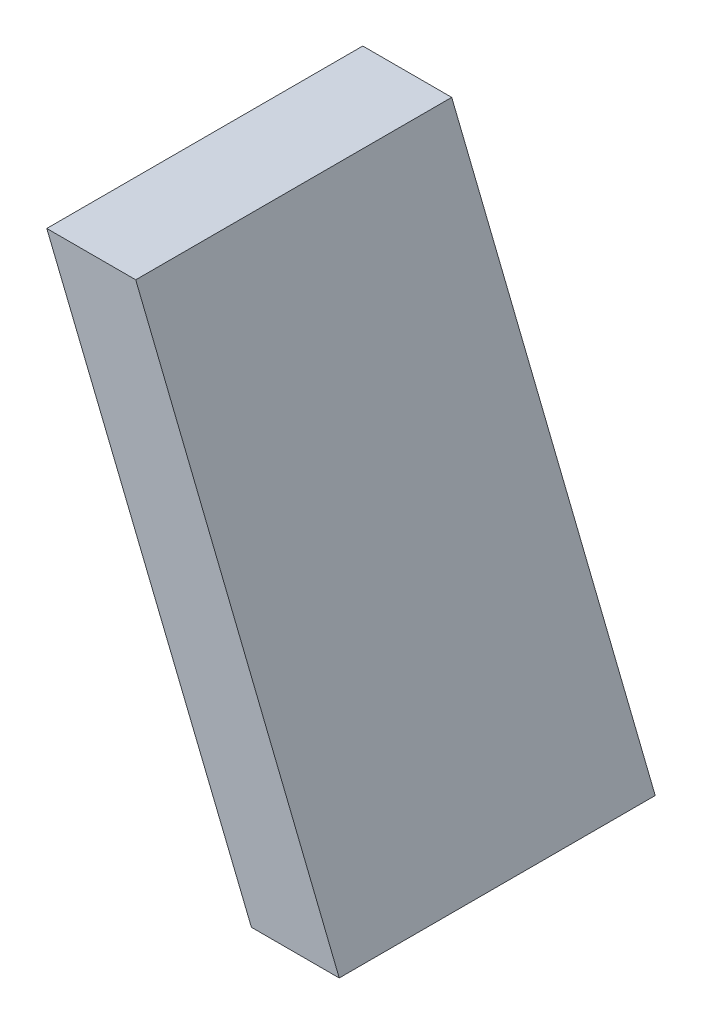
ISO-10303-21;
HEADER;
FILE_DESCRIPTION(('STEP AP214'),'2;1');
FILE_NAME('part.step','',(''),(''),'','','');
FILE_SCHEMA(('AUTOMOTIVE_DESIGN { 1 0 10303 214 1 1 1 1 }'));
ENDSEC;
DATA;
#1=APPLICATION_CONTEXT('core data for automotive mechanical design processes');
#2=APPLICATION_PROTOCOL_DEFINITION('international standard','automotive_design',2000,#1);
#3=PRODUCT_CONTEXT('',#1,'mechanical');
#4=PRODUCT('Part','Part','',(#3));
#5=PRODUCT_RELATED_PRODUCT_CATEGORY('part','',(#4));
#6=PRODUCT_DEFINITION_FORMATION('','',#4);
#7=PRODUCT_DEFINITION_CONTEXT('part definition',#1,'design');
#8=PRODUCT_DEFINITION('design','',#6,#7);
#9=PRODUCT_DEFINITION_SHAPE('','',#8);
#10=(LENGTH_UNIT() NAMED_UNIT(*) SI_UNIT(.MILLI.,.METRE.));
#11=(NAMED_UNIT(*) PLANE_ANGLE_UNIT() SI_UNIT($,.RADIAN.));
#12=(NAMED_UNIT(*) SI_UNIT($,.STERADIAN.) SOLID_ANGLE_UNIT());
#13=UNCERTAINTY_MEASURE_WITH_UNIT(LENGTH_MEASURE(1.E-05),#10,'distance_accuracy_value','');
#14=(GEOMETRIC_REPRESENTATION_CONTEXT(3) GLOBAL_UNCERTAINTY_ASSIGNED_CONTEXT((#13)) GLOBAL_UNIT_ASSIGNED_CONTEXT((#10,
#11,#12)) REPRESENTATION_CONTEXT('',''));
#15=CARTESIAN_POINT('',(0.,0.,0.));
#16=DIRECTION('',(0.,0.,1.));
#17=DIRECTION('',(1.,0.,0.));
#18=AXIS2_PLACEMENT_3D('',#15,#16,#17);
#19=CARTESIAN_POINT('',(5.752453826906,1.349600538179,0.));
#20=DIRECTION('',(-0.926254074513304,-0.376899707412333,0.));
#21=DIRECTION('',(0.376899707412333,-0.926254074513304,0.));
#22=AXIS2_PLACEMENT_3D('',#19,#20,#21);
#23=PLANE('',#22);
#24=DIRECTION('',(0.376899707412333,-0.926254074513304,0.));
#25=VECTOR('',#24,1.);
#26=CARTESIAN_POINT('',(5.752453826906,1.349600538179,0.));
#27=LINE('',#26,#25);
#28=CARTESIAN_POINT('',(5.752453826906,1.349600538179,0.));
#29=VERTEX_POINT('',#28);
#30=CARTESIAN_POINT('',(5.817213112897,1.19045063349,0.));
#31=VERTEX_POINT('',#30);
#32=EDGE_CURVE('E11',#29,#31,#27,.T.);
#33=ORIENTED_EDGE('',*,*,#32,.T.);
#34=DIRECTION('',(0.,0.,1.));
#35=VECTOR('',#34,1.);
#36=CARTESIAN_POINT('',(5.817213112897,1.19045063349,0.));
#37=LINE('',#36,#35);
#38=CARTESIAN_POINT('',(5.817213112897,1.19045063349,0.1));
#39=VERTEX_POINT('',#38);
#40=EDGE_CURVE('E24',#31,#39,#37,.T.);
#41=ORIENTED_EDGE('',*,*,#40,.T.);
#42=DIRECTION('',(0.376899707412333,-0.926254074513304,0.));
#43=VECTOR('',#42,1.);
#44=CARTESIAN_POINT('',(5.752453826906,1.349600538179,0.1));
#45=LINE('',#44,#43);
#46=CARTESIAN_POINT('',(5.752453826906,1.349600538179,0.1));
#47=VERTEX_POINT('',#46);
#48=EDGE_CURVE('E75',#47,#39,#45,.T.);
#49=ORIENTED_EDGE('',*,*,#48,.F.);
#50=DIRECTION('',(0.,0.,1.));
#51=VECTOR('',#50,1.);
#52=CARTESIAN_POINT('',(5.752453826906,1.349600538179,0.));
#53=LINE('',#52,#51);
#54=EDGE_CURVE('E86',#29,#47,#53,.T.);
#55=ORIENTED_EDGE('',*,*,#54,.F.);
#56=EDGE_LOOP('',(#33,#41,#49,#55));
#57=FACE_BOUND('',#56,.T.);
#58=ADVANCED_FACE('F17',(#57),#23,.T.);
#59=CARTESIAN_POINT('',(5.780602626906,1.349600538179,0.));
#60=DIRECTION('',(0.,1.,0.));
#61=DIRECTION('',(-1.,0.,0.));
#62=AXIS2_PLACEMENT_3D('',#59,#60,#61);
#63=PLANE('',#62);
#64=DIRECTION('',(-1.,0.,0.));
#65=VECTOR('',#64,1.);
#66=CARTESIAN_POINT('',(5.780602626906,1.349600538179,0.));
#67=LINE('',#66,#65);
#68=CARTESIAN_POINT('',(5.780602626906,1.349600538179,0.));
#69=VERTEX_POINT('',#68);
#70=EDGE_CURVE('E83',#69,#29,#67,.T.);
#71=ORIENTED_EDGE('',*,*,#70,.T.);
#72=ORIENTED_EDGE('',*,*,#54,.T.);
#73=DIRECTION('',(-1.,0.,0.));
#74=VECTOR('',#73,1.);
#75=CARTESIAN_POINT('',(5.780602626906,1.349600538179,0.1));
#76=LINE('',#75,#74);
#77=CARTESIAN_POINT('',(5.780602626906,1.349600538179,0.1));
#78=VERTEX_POINT('',#77);
#79=EDGE_CURVE('E81',#78,#47,#76,.T.);
#80=ORIENTED_EDGE('',*,*,#79,.F.);
#81=DIRECTION('',(0.,0.,1.));
#82=VECTOR('',#81,1.);
#83=CARTESIAN_POINT('',(5.780602626906,1.349600538179,0.));
#84=LINE('',#83,#82);
#85=EDGE_CURVE('E61',#69,#78,#84,.T.);
#86=ORIENTED_EDGE('',*,*,#85,.F.);
#87=EDGE_LOOP('',(#71,#72,#80,#86));
#88=FACE_BOUND('',#87,.T.);
#89=ADVANCED_FACE('F91',(#88),#63,.T.);
#90=CARTESIAN_POINT('',(5.845004508976,1.19045063349,0.));
#91=DIRECTION('',(0.926979092175816,0.375112999866574,0.));
#92=DIRECTION('',(-0.375112999866574,0.926979092175816,0.));
#93=AXIS2_PLACEMENT_3D('',#90,#91,#92);
#94=PLANE('',#93);
#95=DIRECTION('',(-0.375112999866574,0.926979092175816,0.));
#96=VECTOR('',#95,1.);
#97=CARTESIAN_POINT('',(5.845004508976,1.19045063349,0.));
#98=LINE('',#97,#96);
#99=CARTESIAN_POINT('',(5.845004508976,1.19045063349,0.));
#100=VERTEX_POINT('',#99);
#101=EDGE_CURVE('E65',#100,#69,#98,.T.);
#102=ORIENTED_EDGE('',*,*,#101,.T.);
#103=ORIENTED_EDGE('',*,*,#85,.T.);
#104=DIRECTION('',(-0.375112999866574,0.926979092175816,0.));
#105=VECTOR('',#104,1.);
#106=CARTESIAN_POINT('',(5.845004508976,1.19045063349,0.1));
#107=LINE('',#106,#105);
#108=CARTESIAN_POINT('',(5.845004508976,1.19045063349,0.1));
#109=VERTEX_POINT('',#108);
#110=EDGE_CURVE('E54',#109,#78,#107,.T.);
#111=ORIENTED_EDGE('',*,*,#110,.F.);
#112=DIRECTION('',(0.,0.,1.));
#113=VECTOR('',#112,1.);
#114=CARTESIAN_POINT('',(5.845004508976,1.19045063349,0.));
#115=LINE('',#114,#113);
#116=EDGE_CURVE('E58',#100,#109,#115,.T.);
#117=ORIENTED_EDGE('',*,*,#116,.F.);
#118=EDGE_LOOP('',(#102,#103,#111,#117));
#119=FACE_BOUND('',#118,.T.);
#120=ADVANCED_FACE('F57',(#119),#94,.T.);
#121=CARTESIAN_POINT('',(5.817213112897,1.19045063349,0.));
#122=DIRECTION('',(0.,-1.,0.));
#123=DIRECTION('',(1.,0.,0.));
#124=AXIS2_PLACEMENT_3D('',#121,#122,#123);
#125=PLANE('',#124);
#126=DIRECTION('',(1.,0.,0.));
#127=VECTOR('',#126,1.);
#128=CARTESIAN_POINT('',(5.817213112897,1.19045063349,0.));
#129=LINE('',#128,#127);
#130=EDGE_CURVE('E71',#31,#100,#129,.T.);
#131=ORIENTED_EDGE('',*,*,#130,.T.);
#132=ORIENTED_EDGE('',*,*,#116,.T.);
#133=DIRECTION('',(1.,0.,0.));
#134=VECTOR('',#133,1.);
#135=CARTESIAN_POINT('',(5.817213112897,1.19045063349,0.1));
#136=LINE('',#135,#134);
#137=EDGE_CURVE('E70',#39,#109,#136,.T.);
#138=ORIENTED_EDGE('',*,*,#137,.F.);
#139=ORIENTED_EDGE('',*,*,#40,.F.);
#140=EDGE_LOOP('',(#131,#132,#138,#139));
#141=FACE_BOUND('',#140,.T.);
#142=ADVANCED_FACE('F69',(#141),#125,.T.);
#143=CARTESIAN_POINT('',(5.798784922354,1.270096785122,0.1));
#144=DIRECTION('',(0.,0.,1.));
#145=DIRECTION('',(1.,0.,0.));
#146=AXIS2_PLACEMENT_3D('',#143,#144,#145);
#147=PLANE('',#146);
#148=ORIENTED_EDGE('',*,*,#137,.T.);
#149=ORIENTED_EDGE('',*,*,#110,.T.);
#150=ORIENTED_EDGE('',*,*,#79,.T.);
#151=ORIENTED_EDGE('',*,*,#48,.T.);
#152=EDGE_LOOP('',(#148,#149,#150,#151));
#153=FACE_BOUND('',#152,.T.);
#154=ADVANCED_FACE('F74',(#153),#147,.T.);
#155=CARTESIAN_POINT('',(5.798784922354,1.270096785122,0.));
#156=DIRECTION('',(0.,0.,1.));
#157=DIRECTION('',(1.,0.,0.));
#158=AXIS2_PLACEMENT_3D('',#155,#156,#157);
#159=PLANE('',#158);
#160=ORIENTED_EDGE('',*,*,#130,.F.);
#161=ORIENTED_EDGE('',*,*,#32,.F.);
#162=ORIENTED_EDGE('',*,*,#70,.F.);
#163=ORIENTED_EDGE('',*,*,#101,.F.);
#164=EDGE_LOOP('',(#160,#161,#162,#163));
#165=FACE_BOUND('',#164,.T.);
#166=ADVANCED_FACE('F89',(#165),#159,.F.);
#167=CLOSED_SHELL('',(#58,#89,#120,#142,#154,#166));
#168=MANIFOLD_SOLID_BREP('B1',#167);
#169=ADVANCED_BREP_SHAPE_REPRESENTATION('',(#18,#168),#14);
#170=SHAPE_DEFINITION_REPRESENTATION(#9,#169);
ENDSEC;
END-ISO-10303-21;
